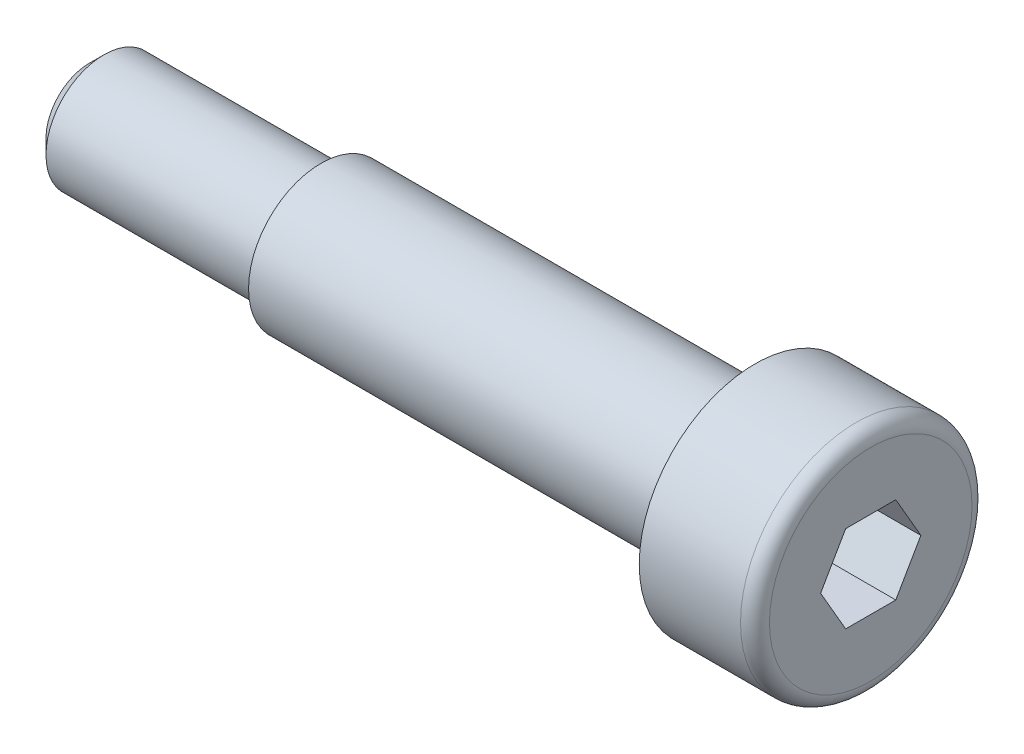
ISO-10303-21;
HEADER;
FILE_DESCRIPTION(('STEP AP214'),'2;1');
FILE_NAME('part.step','',(''),(''),'','','');
FILE_SCHEMA(('AUTOMOTIVE_DESIGN { 1 0 10303 214 1 1 1 1 }'));
ENDSEC;
DATA;
#1=APPLICATION_CONTEXT('core data for automotive mechanical design processes');
#2=APPLICATION_PROTOCOL_DEFINITION('international standard','automotive_design',2000,#1);
#3=PRODUCT_CONTEXT('',#1,'mechanical');
#4=PRODUCT('Part','Part','',(#3));
#5=PRODUCT_RELATED_PRODUCT_CATEGORY('part','',(#4));
#6=PRODUCT_DEFINITION_FORMATION('','',#4);
#7=PRODUCT_DEFINITION_CONTEXT('part definition',#1,'design');
#8=PRODUCT_DEFINITION('design','',#6,#7);
#9=PRODUCT_DEFINITION_SHAPE('','',#8);
#10=(LENGTH_UNIT() NAMED_UNIT(*) SI_UNIT(.MILLI.,.METRE.));
#11=(NAMED_UNIT(*) PLANE_ANGLE_UNIT() SI_UNIT($,.RADIAN.));
#12=(NAMED_UNIT(*) SI_UNIT($,.STERADIAN.) SOLID_ANGLE_UNIT());
#13=UNCERTAINTY_MEASURE_WITH_UNIT(LENGTH_MEASURE(1.E-05),#10,'distance_accuracy_value','');
#14=(GEOMETRIC_REPRESENTATION_CONTEXT(3) GLOBAL_UNCERTAINTY_ASSIGNED_CONTEXT((#13)) GLOBAL_UNIT_ASSIGNED_CONTEXT((#10,
#11,#12)) REPRESENTATION_CONTEXT('',''));
#15=CARTESIAN_POINT('',(0.,0.,0.));
#16=DIRECTION('',(0.,0.,1.));
#17=DIRECTION('',(1.,0.,0.));
#18=AXIS2_PLACEMENT_3D('',#15,#16,#17);
#19=CARTESIAN_POINT('',(0.,0.,0.));
#20=DIRECTION('',(-1.,0.,0.));
#21=DIRECTION('',(0.,0.,1.));
#22=AXIS2_PLACEMENT_3D('',#19,#20,#21);
#23=PLANE('',#22);
#24=DIRECTION('',(0.,0.866025403784439,0.5));
#25=VECTOR('',#24,1.);
#26=CARTESIAN_POINT('',(0.,0.,-1.73205080756888));
#27=LINE('',#26,#25);
#28=CARTESIAN_POINT('',(0.,0.,-1.73205080756888));
#29=VERTEX_POINT('',#28);
#30=CARTESIAN_POINT('',(0.,1.5,-0.866025403784438));
#31=VERTEX_POINT('',#30);
#32=EDGE_CURVE('E148',#29,#31,#27,.T.);
#33=ORIENTED_EDGE('',*,*,#32,.F.);
#34=DIRECTION('',(0.,0.866025403784439,-0.5));
#35=VECTOR('',#34,1.);
#36=CARTESIAN_POINT('',(0.,-1.5,-0.866025403784439));
#37=LINE('',#36,#35);
#38=CARTESIAN_POINT('',(0.,-1.5,-0.866025403784439));
#39=VERTEX_POINT('',#38);
#40=EDGE_CURVE('E58',#39,#29,#37,.T.);
#41=ORIENTED_EDGE('',*,*,#40,.F.);
#42=DIRECTION('',(0.,0.,-1.));
#43=VECTOR('',#42,1.);
#44=CARTESIAN_POINT('',(0.,-1.5,0.866025403784438));
#45=LINE('',#44,#43);
#46=CARTESIAN_POINT('',(0.,-1.5,0.866025403784438));
#47=VERTEX_POINT('',#46);
#48=EDGE_CURVE('E160',#47,#39,#45,.T.);
#49=ORIENTED_EDGE('',*,*,#48,.F.);
#50=DIRECTION('',(0.,-0.866025403784439,-0.5));
#51=VECTOR('',#50,1.);
#52=CARTESIAN_POINT('',(0.,0.,1.73205080756888));
#53=LINE('',#52,#51);
#54=CARTESIAN_POINT('',(0.,0.,1.73205080756888));
#55=VERTEX_POINT('',#54);
#56=EDGE_CURVE('E157',#55,#47,#53,.T.);
#57=ORIENTED_EDGE('',*,*,#56,.F.);
#58=DIRECTION('',(0.,-0.866025403784439,0.5));
#59=VECTOR('',#58,1.);
#60=CARTESIAN_POINT('',(0.,1.5,0.866025403784439));
#61=LINE('',#60,#59);
#62=CARTESIAN_POINT('',(0.,1.5,0.866025403784439));
#63=VERTEX_POINT('',#62);
#64=EDGE_CURVE('E115',#63,#55,#61,.T.);
#65=ORIENTED_EDGE('',*,*,#64,.F.);
#66=DIRECTION('',(0.,0.,1.));
#67=VECTOR('',#66,1.);
#68=CARTESIAN_POINT('',(0.,1.5,-0.866025403784438));
#69=LINE('',#68,#67);
#70=EDGE_CURVE('E152',#31,#63,#69,.T.);
#71=ORIENTED_EDGE('',*,*,#70,.F.);
#72=EDGE_LOOP('',(#33,#41,#49,#57,#65,#71));
#73=FACE_BOUND('',#72,.T.);
#74=CARTESIAN_POINT('',(0.,0.,0.));
#75=DIRECTION('',(-1.,0.,0.));
#76=DIRECTION('',(0.,0.,1.));
#77=AXIS2_PLACEMENT_3D('',#74,#75,#76);
#78=CIRCLE('',#77,3.5);
#79=CARTESIAN_POINT('',(0.,0.,3.5));
#80=VERTEX_POINT('',#79);
#81=EDGE_CURVE('E195',#80,#80,#78,.T.);
#82=ORIENTED_EDGE('',*,*,#81,.F.);
#83=EDGE_LOOP('',(#82));
#84=FACE_BOUND('',#83,.T.);
#85=ADVANCED_FACE('F40',(#73,#84),#23,.F.);
#86=CARTESIAN_POINT('',(-0.5,0.,0.));
#87=DIRECTION('',(-1.,0.,0.));
#88=DIRECTION('',(0.,0.,1.));
#89=AXIS2_PLACEMENT_3D('',#86,#87,#88);
#90=TOROIDAL_SURFACE('',#89,3.5,0.5);
#91=CARTESIAN_POINT('',(-0.5,0.,0.));
#92=DIRECTION('',(-1.,0.,0.));
#93=DIRECTION('',(0.,0.,1.));
#94=AXIS2_PLACEMENT_3D('',#91,#92,#93);
#95=CIRCLE('',#94,4.);
#96=CARTESIAN_POINT('',(-0.5,0.,4.));
#97=VERTEX_POINT('',#96);
#98=EDGE_CURVE('E191',#97,#97,#95,.T.);
#99=ORIENTED_EDGE('',*,*,#98,.F.);
#100=EDGE_LOOP('',(#99));
#101=FACE_BOUND('',#100,.T.);
#102=ORIENTED_EDGE('',*,*,#81,.T.);
#103=EDGE_LOOP('',(#102));
#104=FACE_BOUND('',#103,.T.);
#105=ADVANCED_FACE('F216',(#101,#104),#90,.T.);
#106=CARTESIAN_POINT('',(0.,0.,0.));
#107=DIRECTION('',(-1.,0.,0.));
#108=DIRECTION('',(0.,0.,1.));
#109=AXIS2_PLACEMENT_3D('',#106,#107,#108);
#110=CYLINDRICAL_SURFACE('',#109,4.);
#111=CARTESIAN_POINT('',(-4.,0.,0.));
#112=DIRECTION('',(-1.,0.,0.));
#113=DIRECTION('',(0.,0.,1.));
#114=AXIS2_PLACEMENT_3D('',#111,#112,#113);
#115=CIRCLE('',#114,4.);
#116=CARTESIAN_POINT('',(-4.,0.,4.));
#117=VERTEX_POINT('',#116);
#118=EDGE_CURVE('E187',#117,#117,#115,.T.);
#119=ORIENTED_EDGE('',*,*,#118,.F.);
#120=EDGE_LOOP('',(#119));
#121=FACE_BOUND('',#120,.T.);
#122=ORIENTED_EDGE('',*,*,#98,.T.);
#123=EDGE_LOOP('',(#122));
#124=FACE_BOUND('',#123,.T.);
#125=ADVANCED_FACE('F221',(#121,#124),#110,.T.);
#126=CARTESIAN_POINT('',(-4.,4.,0.));
#127=DIRECTION('',(1.,0.,0.));
#128=DIRECTION('',(0.,0.,-1.));
#129=AXIS2_PLACEMENT_3D('',#126,#127,#128);
#130=PLANE('',#129);
#131=CARTESIAN_POINT('',(-4.,0.,0.));
#132=DIRECTION('',(-1.,0.,0.));
#133=DIRECTION('',(0.,0.,1.));
#134=AXIS2_PLACEMENT_3D('',#131,#132,#133);
#135=CIRCLE('',#134,2.5);
#136=CARTESIAN_POINT('',(-4.,0.,2.5));
#137=VERTEX_POINT('',#136);
#138=EDGE_CURVE('E183',#137,#137,#135,.T.);
#139=ORIENTED_EDGE('',*,*,#138,.F.);
#140=EDGE_LOOP('',(#139));
#141=FACE_BOUND('',#140,.T.);
#142=ORIENTED_EDGE('',*,*,#118,.T.);
#143=EDGE_LOOP('',(#142));
#144=FACE_BOUND('',#143,.T.);
#145=ADVANCED_FACE('F229',(#141,#144),#130,.F.);
#146=CARTESIAN_POINT('',(0.,0.,0.));
#147=DIRECTION('',(-1.,0.,0.));
#148=DIRECTION('',(0.,0.,1.));
#149=AXIS2_PLACEMENT_3D('',#146,#147,#148);
#150=CYLINDRICAL_SURFACE('',#149,2.5);
#151=CARTESIAN_POINT('',(-19.,0.,0.));
#152=DIRECTION('',(-1.,0.,0.));
#153=DIRECTION('',(0.,0.,1.));
#154=AXIS2_PLACEMENT_3D('',#151,#152,#153);
#155=CIRCLE('',#154,2.5);
#156=CARTESIAN_POINT('',(-19.,0.,2.5));
#157=VERTEX_POINT('',#156);
#158=EDGE_CURVE('E179',#157,#157,#155,.T.);
#159=ORIENTED_EDGE('',*,*,#158,.F.);
#160=EDGE_LOOP('',(#159));
#161=FACE_BOUND('',#160,.T.);
#162=ORIENTED_EDGE('',*,*,#138,.T.);
#163=EDGE_LOOP('',(#162));
#164=FACE_BOUND('',#163,.T.);
#165=ADVANCED_FACE('F233',(#161,#164),#150,.T.);
#166=CARTESIAN_POINT('',(-19.,2.5,0.));
#167=DIRECTION('',(1.,0.,0.));
#168=DIRECTION('',(0.,0.,-1.));
#169=AXIS2_PLACEMENT_3D('',#166,#167,#168);
#170=PLANE('',#169);
#171=CARTESIAN_POINT('',(-19.,0.,0.));
#172=DIRECTION('',(-1.,0.,0.));
#173=DIRECTION('',(0.,0.,1.));
#174=AXIS2_PLACEMENT_3D('',#171,#172,#173);
#175=CIRCLE('',#174,2.);
#176=CARTESIAN_POINT('',(-19.,0.,2.));
#177=VERTEX_POINT('',#176);
#178=EDGE_CURVE('E166',#177,#177,#175,.T.);
#179=ORIENTED_EDGE('',*,*,#178,.F.);
#180=EDGE_LOOP('',(#179));
#181=FACE_BOUND('',#180,.T.);
#182=ORIENTED_EDGE('',*,*,#158,.T.);
#183=EDGE_LOOP('',(#182));
#184=FACE_BOUND('',#183,.T.);
#185=ADVANCED_FACE('F237',(#181,#184),#170,.F.);
#186=CARTESIAN_POINT('',(0.,0.,0.));
#187=DIRECTION('',(-1.,0.,0.));
#188=DIRECTION('',(0.,0.,1.));
#189=AXIS2_PLACEMENT_3D('',#186,#187,#188);
#190=CYLINDRICAL_SURFACE('',#189,2.);
#191=CARTESIAN_POINT('',(-26.5,0.,0.));
#192=DIRECTION('',(1.,0.,0.));
#193=DIRECTION('',(0.,0.,-1.));
#194=AXIS2_PLACEMENT_3D('',#191,#192,#193);
#195=CIRCLE('',#194,2.);
#196=CARTESIAN_POINT('',(-26.5,0.,-2.));
#197=VERTEX_POINT('',#196);
#198=EDGE_CURVE('E11',#197,#197,#195,.T.);
#199=ORIENTED_EDGE('',*,*,#198,.T.);
#200=EDGE_LOOP('',(#199));
#201=FACE_BOUND('',#200,.T.);
#202=ORIENTED_EDGE('',*,*,#178,.T.);
#203=EDGE_LOOP('',(#202));
#204=FACE_BOUND('',#203,.T.);
#205=ADVANCED_FACE('F212',(#201,#204),#190,.T.);
#206=CARTESIAN_POINT('',(-27.,2.,0.));
#207=DIRECTION('',(1.,0.,0.));
#208=DIRECTION('',(0.,0.,-1.));
#209=AXIS2_PLACEMENT_3D('',#206,#207,#208);
#210=PLANE('',#209);
#211=CARTESIAN_POINT('',(-27.,0.,0.));
#212=DIRECTION('',(1.,0.,0.));
#213=DIRECTION('',(0.,0.,-1.));
#214=AXIS2_PLACEMENT_3D('',#211,#212,#213);
#215=CIRCLE('',#214,1.5);
#216=CARTESIAN_POINT('',(-27.,0.,-1.5));
#217=VERTEX_POINT('',#216);
#218=EDGE_CURVE('E48',#217,#217,#215,.F.);
#219=ORIENTED_EDGE('',*,*,#218,.T.);
#220=EDGE_LOOP('',(#219));
#221=FACE_BOUND('',#220,.T.);
#222=ADVANCED_FACE('F201',(#221),#210,.F.);
#223=CARTESIAN_POINT('',(-27.,0.,0.));
#224=DIRECTION('',(1.,0.,0.));
#225=DIRECTION('',(0.,0.,-1.));
#226=AXIS2_PLACEMENT_3D('',#223,#224,#225);
#227=CONICAL_SURFACE('',#226,1.5,0.785398163397449);
#228=ORIENTED_EDGE('',*,*,#198,.F.);
#229=EDGE_LOOP('',(#228));
#230=FACE_BOUND('',#229,.T.);
#231=ORIENTED_EDGE('',*,*,#218,.F.);
#232=EDGE_LOOP('',(#231));
#233=FACE_BOUND('',#232,.T.);
#234=ADVANCED_FACE('F42',(#230,#233),#227,.T.);
#235=CARTESIAN_POINT('',(-2.4,-1.5,-0.866025403784439));
#236=DIRECTION('',(0.,-0.5,-0.866025403784439));
#237=DIRECTION('',(0.,0.866025403784439,-0.5));
#238=AXIS2_PLACEMENT_3D('',#235,#236,#237);
#239=PLANE('',#238);
#240=ORIENTED_EDGE('',*,*,#40,.T.);
#241=DIRECTION('',(1.,0.,0.));
#242=VECTOR('',#241,1.);
#243=CARTESIAN_POINT('',(-2.4,0.,-1.73205080756888));
#244=LINE('',#243,#242);
#245=CARTESIAN_POINT('',(-2.4,0.,-1.73205080756888));
#246=VERTEX_POINT('',#245);
#247=EDGE_CURVE('E95',#246,#29,#244,.T.);
#248=ORIENTED_EDGE('',*,*,#247,.F.);
#249=DIRECTION('',(0.,0.866025403784439,-0.5));
#250=VECTOR('',#249,1.);
#251=CARTESIAN_POINT('',(-2.4,-1.5,-0.866025403784439));
#252=LINE('',#251,#250);
#253=CARTESIAN_POINT('',(-2.4,-1.5,-0.866025403784439));
#254=VERTEX_POINT('',#253);
#255=EDGE_CURVE('E163',#254,#246,#252,.T.);
#256=ORIENTED_EDGE('',*,*,#255,.F.);
#257=DIRECTION('',(1.,0.,0.));
#258=VECTOR('',#257,1.);
#259=CARTESIAN_POINT('',(-2.4,-1.5,-0.866025403784439));
#260=LINE('',#259,#258);
#261=EDGE_CURVE('E67',#254,#39,#260,.T.);
#262=ORIENTED_EDGE('',*,*,#261,.T.);
#263=EDGE_LOOP('',(#240,#248,#256,#262));
#264=FACE_BOUND('',#263,.T.);
#265=ADVANCED_FACE('F204',(#264),#239,.F.);
#266=CARTESIAN_POINT('',(-2.4,-1.5,0.866025403784438));
#267=DIRECTION('',(0.,-1.,0.));
#268=DIRECTION('',(0.,0.,-1.));
#269=AXIS2_PLACEMENT_3D('',#266,#267,#268);
#270=PLANE('',#269);
#271=ORIENTED_EDGE('',*,*,#48,.T.);
#272=ORIENTED_EDGE('',*,*,#261,.F.);
#273=DIRECTION('',(0.,0.,-1.));
#274=VECTOR('',#273,1.);
#275=CARTESIAN_POINT('',(-2.4,-1.5,0.866025403784438));
#276=LINE('',#275,#274);
#277=CARTESIAN_POINT('',(-2.4,-1.5,0.866025403784438));
#278=VERTEX_POINT('',#277);
#279=EDGE_CURVE('E129',#278,#254,#276,.T.);
#280=ORIENTED_EDGE('',*,*,#279,.F.);
#281=DIRECTION('',(1.,0.,0.));
#282=VECTOR('',#281,1.);
#283=CARTESIAN_POINT('',(-2.4,-1.5,0.866025403784438));
#284=LINE('',#283,#282);
#285=EDGE_CURVE('E120',#278,#47,#284,.T.);
#286=ORIENTED_EDGE('',*,*,#285,.T.);
#287=EDGE_LOOP('',(#271,#272,#280,#286));
#288=FACE_BOUND('',#287,.T.);
#289=ADVANCED_FACE('F210',(#288),#270,.F.);
#290=CARTESIAN_POINT('',(-2.4,0.,1.73205080756888));
#291=DIRECTION('',(0.,-0.5,0.866025403784439));
#292=DIRECTION('',(0.,-0.866025403784439,-0.5));
#293=AXIS2_PLACEMENT_3D('',#290,#291,#292);
#294=PLANE('',#293);
#295=ORIENTED_EDGE('',*,*,#56,.T.);
#296=ORIENTED_EDGE('',*,*,#285,.F.);
#297=DIRECTION('',(0.,-0.866025403784439,-0.5));
#298=VECTOR('',#297,1.);
#299=CARTESIAN_POINT('',(-2.4,0.,1.73205080756888));
#300=LINE('',#299,#298);
#301=CARTESIAN_POINT('',(-2.4,0.,1.73205080756888));
#302=VERTEX_POINT('',#301);
#303=EDGE_CURVE('E124',#302,#278,#300,.T.);
#304=ORIENTED_EDGE('',*,*,#303,.F.);
#305=DIRECTION('',(1.,0.,0.));
#306=VECTOR('',#305,1.);
#307=CARTESIAN_POINT('',(-2.4,0.,1.73205080756888));
#308=LINE('',#307,#306);
#309=EDGE_CURVE('E108',#302,#55,#308,.T.);
#310=ORIENTED_EDGE('',*,*,#309,.T.);
#311=EDGE_LOOP('',(#295,#296,#304,#310));
#312=FACE_BOUND('',#311,.T.);
#313=ADVANCED_FACE('F125',(#312),#294,.F.);
#314=CARTESIAN_POINT('',(-2.4,1.5,0.866025403784439));
#315=DIRECTION('',(0.,0.5,0.866025403784439));
#316=DIRECTION('',(0.,-0.866025403784439,0.5));
#317=AXIS2_PLACEMENT_3D('',#314,#315,#316);
#318=PLANE('',#317);
#319=ORIENTED_EDGE('',*,*,#64,.T.);
#320=ORIENTED_EDGE('',*,*,#309,.F.);
#321=DIRECTION('',(0.,-0.866025403784439,0.5));
#322=VECTOR('',#321,1.);
#323=CARTESIAN_POINT('',(-2.4,1.5,0.866025403784439));
#324=LINE('',#323,#322);
#325=CARTESIAN_POINT('',(-2.4,1.5,0.866025403784439));
#326=VERTEX_POINT('',#325);
#327=EDGE_CURVE('E112',#326,#302,#324,.T.);
#328=ORIENTED_EDGE('',*,*,#327,.F.);
#329=DIRECTION('',(1.,0.,0.));
#330=VECTOR('',#329,1.);
#331=CARTESIAN_POINT('',(-2.4,1.5,0.866025403784439));
#332=LINE('',#331,#330);
#333=EDGE_CURVE('E121',#326,#63,#332,.T.);
#334=ORIENTED_EDGE('',*,*,#333,.T.);
#335=EDGE_LOOP('',(#319,#320,#328,#334));
#336=FACE_BOUND('',#335,.T.);
#337=ADVANCED_FACE('F110',(#336),#318,.F.);
#338=CARTESIAN_POINT('',(-2.4,1.5,-0.866025403784438));
#339=DIRECTION('',(0.,1.,0.));
#340=DIRECTION('',(0.,0.,1.));
#341=AXIS2_PLACEMENT_3D('',#338,#339,#340);
#342=PLANE('',#341);
#343=ORIENTED_EDGE('',*,*,#70,.T.);
#344=ORIENTED_EDGE('',*,*,#333,.F.);
#345=DIRECTION('',(0.,0.,1.));
#346=VECTOR('',#345,1.);
#347=CARTESIAN_POINT('',(-2.4,1.5,-0.866025403784438));
#348=LINE('',#347,#346);
#349=CARTESIAN_POINT('',(-2.4,1.5,-0.866025403784438));
#350=VERTEX_POINT('',#349);
#351=EDGE_CURVE('E135',#350,#326,#348,.T.);
#352=ORIENTED_EDGE('',*,*,#351,.F.);
#353=DIRECTION('',(1.,0.,0.));
#354=VECTOR('',#353,1.);
#355=CARTESIAN_POINT('',(-2.4,1.5,-0.866025403784438));
#356=LINE('',#355,#354);
#357=EDGE_CURVE('E171',#350,#31,#356,.T.);
#358=ORIENTED_EDGE('',*,*,#357,.T.);
#359=EDGE_LOOP('',(#343,#344,#352,#358));
#360=FACE_BOUND('',#359,.T.);
#361=ADVANCED_FACE('F248',(#360),#342,.F.);
#362=CARTESIAN_POINT('',(-2.4,0.,-1.73205080756888));
#363=DIRECTION('',(0.,0.5,-0.866025403784438));
#364=DIRECTION('',(0.,0.866025403784439,0.5));
#365=AXIS2_PLACEMENT_3D('',#362,#363,#364);
#366=PLANE('',#365);
#367=ORIENTED_EDGE('',*,*,#32,.T.);
#368=ORIENTED_EDGE('',*,*,#357,.F.);
#369=DIRECTION('',(0.,0.866025403784439,0.5));
#370=VECTOR('',#369,1.);
#371=CARTESIAN_POINT('',(-2.4,0.,-1.73205080756888));
#372=LINE('',#371,#370);
#373=EDGE_CURVE('E140',#246,#350,#372,.T.);
#374=ORIENTED_EDGE('',*,*,#373,.F.);
#375=ORIENTED_EDGE('',*,*,#247,.T.);
#376=EDGE_LOOP('',(#367,#368,#374,#375));
#377=FACE_BOUND('',#376,.T.);
#378=ADVANCED_FACE('F245',(#377),#366,.F.);
#379=CARTESIAN_POINT('',(-2.4,0.,0.));
#380=DIRECTION('',(1.,0.,0.));
#381=DIRECTION('',(0.,0.,-1.));
#382=AXIS2_PLACEMENT_3D('',#379,#380,#381);
#383=PLANE('',#382);
#384=ORIENTED_EDGE('',*,*,#255,.T.);
#385=ORIENTED_EDGE('',*,*,#373,.T.);
#386=ORIENTED_EDGE('',*,*,#351,.T.);
#387=ORIENTED_EDGE('',*,*,#327,.T.);
#388=ORIENTED_EDGE('',*,*,#303,.T.);
#389=ORIENTED_EDGE('',*,*,#279,.T.);
#390=EDGE_LOOP('',(#384,#385,#386,#387,#388,#389));
#391=FACE_BOUND('',#390,.T.);
#392=ADVANCED_FACE('F132',(#391),#383,.T.);
#393=CLOSED_SHELL('',(#85,#105,#125,#145,#165,#185,#205,#222,#234,#265,#289,#313,#337,#361,#378,#392));
#394=MANIFOLD_SOLID_BREP('B2',#393);
#395=ADVANCED_BREP_SHAPE_REPRESENTATION('',(#18,#394),#14);
#396=SHAPE_DEFINITION_REPRESENTATION(#9,#395);
ENDSEC;
END-ISO-10303-21;
